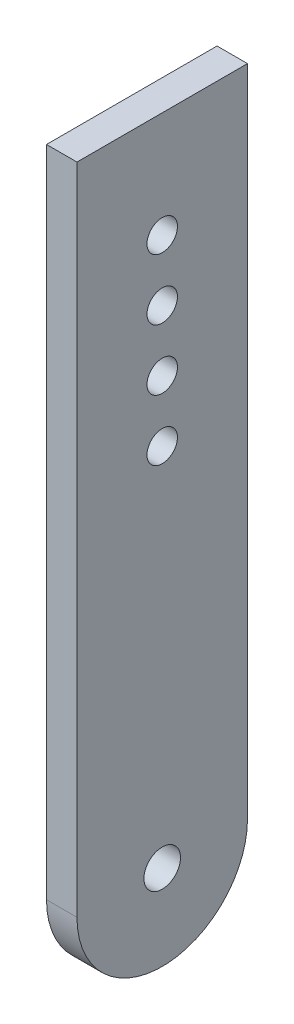
ISO-10303-21;
HEADER;
FILE_DESCRIPTION(('STEP AP214'),'2;1');
FILE_NAME('part.step','',(''),(''),'','','');
FILE_SCHEMA(('AUTOMOTIVE_DESIGN { 1 0 10303 214 1 1 1 1 }'));
ENDSEC;
DATA;
#1=APPLICATION_CONTEXT('core data for automotive mechanical design processes');
#2=APPLICATION_PROTOCOL_DEFINITION('international standard','automotive_design',2000,#1);
#3=PRODUCT_CONTEXT('',#1,'mechanical');
#4=PRODUCT('Part','Part','',(#3));
#5=PRODUCT_RELATED_PRODUCT_CATEGORY('part','',(#4));
#6=PRODUCT_DEFINITION_FORMATION('','',#4);
#7=PRODUCT_DEFINITION_CONTEXT('part definition',#1,'design');
#8=PRODUCT_DEFINITION('design','',#6,#7);
#9=PRODUCT_DEFINITION_SHAPE('','',#8);
#10=(LENGTH_UNIT() NAMED_UNIT(*) SI_UNIT(.MILLI.,.METRE.));
#11=(NAMED_UNIT(*) PLANE_ANGLE_UNIT() SI_UNIT($,.RADIAN.));
#12=(NAMED_UNIT(*) SI_UNIT($,.STERADIAN.) SOLID_ANGLE_UNIT());
#13=UNCERTAINTY_MEASURE_WITH_UNIT(LENGTH_MEASURE(1.E-05),#10,'distance_accuracy_value','');
#14=(GEOMETRIC_REPRESENTATION_CONTEXT(3) GLOBAL_UNCERTAINTY_ASSIGNED_CONTEXT((#13)) GLOBAL_UNIT_ASSIGNED_CONTEXT((#10,
#11,#12)) REPRESENTATION_CONTEXT('',''));
#15=CARTESIAN_POINT('',(0.,0.,0.));
#16=DIRECTION('',(0.,0.,1.));
#17=DIRECTION('',(1.,0.,0.));
#18=AXIS2_PLACEMENT_3D('',#15,#16,#17);
#19=CARTESIAN_POINT('',(2.5,0.,0.));
#20=DIRECTION('',(1.,0.,0.));
#21=DIRECTION('',(0.,0.,-1.));
#22=AXIS2_PLACEMENT_3D('',#19,#20,#21);
#23=PLANE('',#22);
#24=CARTESIAN_POINT('',(2.5,35.,0.));
#25=DIRECTION('',(1.,0.,0.));
#26=DIRECTION('',(0.,0.,-1.));
#27=AXIS2_PLACEMENT_3D('',#24,#25,#26);
#28=CIRCLE('',#27,1.25);
#29=CARTESIAN_POINT('',(2.5,35.,-1.24999999999995));
#30=VERTEX_POINT('',#29);
#31=EDGE_CURVE('E128',#30,#30,#28,.T.);
#32=ORIENTED_EDGE('',*,*,#31,.F.);
#33=EDGE_LOOP('',(#32));
#34=FACE_BOUND('',#33,.T.);
#35=CARTESIAN_POINT('',(2.5,45.,1.5619817514858E-13));
#36=DIRECTION('',(1.,0.,0.));
#37=DIRECTION('',(0.,0.,-1.));
#38=AXIS2_PLACEMENT_3D('',#35,#36,#37);
#39=CIRCLE('',#38,1.25);
#40=CARTESIAN_POINT('',(2.5,45.,-1.24999999999985));
#41=VERTEX_POINT('',#40);
#42=EDGE_CURVE('E116',#41,#41,#39,.T.);
#43=ORIENTED_EDGE('',*,*,#42,.F.);
#44=EDGE_LOOP('',(#43));
#45=FACE_BOUND('',#44,.T.);
#46=DIRECTION('',(0.,0.,1.));
#47=VECTOR('',#46,1.);
#48=CARTESIAN_POINT('',(2.5,53.6953395987777,7.));
#49=LINE('',#48,#47);
#50=CARTESIAN_POINT('',(2.5,53.6953395987778,-7.));
#51=VERTEX_POINT('',#50);
#52=CARTESIAN_POINT('',(2.5,53.6953395987777,7.));
#53=VERTEX_POINT('',#52);
#54=EDGE_CURVE('E86',#51,#53,#49,.T.);
#55=ORIENTED_EDGE('',*,*,#54,.T.);
#56=DIRECTION('',(0.,-1.,0.));
#57=VECTOR('',#56,1.);
#58=CARTESIAN_POINT('',(2.5,0.,7.));
#59=LINE('',#58,#57);
#60=CARTESIAN_POINT('',(2.5,0.,7.));
#61=VERTEX_POINT('',#60);
#62=EDGE_CURVE('E81',#53,#61,#59,.T.);
#63=ORIENTED_EDGE('',*,*,#62,.T.);
#64=CARTESIAN_POINT('',(2.5,0.,0.));
#65=DIRECTION('',(1.,0.,0.));
#66=DIRECTION('',(0.,0.,-1.));
#67=AXIS2_PLACEMENT_3D('',#64,#65,#66);
#68=CIRCLE('',#67,7.);
#69=CARTESIAN_POINT('',(2.5,0.,-7.));
#70=VERTEX_POINT('',#69);
#71=EDGE_CURVE('E84',#61,#70,#68,.T.);
#72=ORIENTED_EDGE('',*,*,#71,.T.);
#73=DIRECTION('',(0.,1.,0.));
#74=VECTOR('',#73,1.);
#75=CARTESIAN_POINT('',(2.5,0.,-7.));
#76=LINE('',#75,#74);
#77=EDGE_CURVE('E51',#70,#51,#76,.T.);
#78=ORIENTED_EDGE('',*,*,#77,.T.);
#79=EDGE_LOOP('',(#55,#63,#72,#78));
#80=FACE_BOUND('',#79,.T.);
#81=CARTESIAN_POINT('',(2.5,0.,0.));
#82=DIRECTION('',(1.,0.,0.));
#83=DIRECTION('',(0.,0.,-1.));
#84=AXIS2_PLACEMENT_3D('',#81,#82,#83);
#85=CIRCLE('',#84,1.5);
#86=CARTESIAN_POINT('',(2.5,0.,-1.5));
#87=VERTEX_POINT('',#86);
#88=EDGE_CURVE('E101',#87,#87,#85,.T.);
#89=ORIENTED_EDGE('',*,*,#88,.F.);
#90=EDGE_LOOP('',(#89));
#91=FACE_BOUND('',#90,.T.);
#92=CARTESIAN_POINT('',(2.5,40.,1.0413211676572E-13));
#93=DIRECTION('',(1.,0.,0.));
#94=DIRECTION('',(0.,0.,-1.));
#95=AXIS2_PLACEMENT_3D('',#92,#93,#94);
#96=CIRCLE('',#95,1.25);
#97=CARTESIAN_POINT('',(2.5,40.,-1.2499999999999));
#98=VERTEX_POINT('',#97);
#99=EDGE_CURVE('E122',#98,#98,#96,.T.);
#100=ORIENTED_EDGE('',*,*,#99,.F.);
#101=EDGE_LOOP('',(#100));
#102=FACE_BOUND('',#101,.T.);
#103=CARTESIAN_POINT('',(2.5,30.,0.));
#104=DIRECTION('',(1.,0.,0.));
#105=DIRECTION('',(0.,0.,-1.));
#106=AXIS2_PLACEMENT_3D('',#103,#104,#105);
#107=CIRCLE('',#106,1.25);
#108=CARTESIAN_POINT('',(2.5,30.,-1.25));
#109=VERTEX_POINT('',#108);
#110=EDGE_CURVE('E134',#109,#109,#107,.T.);
#111=ORIENTED_EDGE('',*,*,#110,.F.);
#112=EDGE_LOOP('',(#111));
#113=FACE_BOUND('',#112,.T.);
#114=ADVANCED_FACE('F34',(#34,#45,#80,#91,#102,#113),#23,.T.);
#115=CARTESIAN_POINT('',(0.,0.,0.));
#116=DIRECTION('',(1.,0.,0.));
#117=DIRECTION('',(0.,0.,-1.));
#118=AXIS2_PLACEMENT_3D('',#115,#116,#117);
#119=PLANE('',#118);
#120=DIRECTION('',(0.,0.,1.));
#121=VECTOR('',#120,1.);
#122=CARTESIAN_POINT('',(0.,53.6953395987777,7.));
#123=LINE('',#122,#121);
#124=CARTESIAN_POINT('',(0.,53.6953395987778,-7.));
#125=VERTEX_POINT('',#124);
#126=CARTESIAN_POINT('',(0.,53.6953395987777,7.));
#127=VERTEX_POINT('',#126);
#128=EDGE_CURVE('E98',#125,#127,#123,.T.);
#129=ORIENTED_EDGE('',*,*,#128,.F.);
#130=DIRECTION('',(0.,1.,0.));
#131=VECTOR('',#130,1.);
#132=CARTESIAN_POINT('',(0.,0.,-7.));
#133=LINE('',#132,#131);
#134=CARTESIAN_POINT('',(0.,0.,-7.));
#135=VERTEX_POINT('',#134);
#136=EDGE_CURVE('E74',#135,#125,#133,.T.);
#137=ORIENTED_EDGE('',*,*,#136,.F.);
#138=CARTESIAN_POINT('',(0.,0.,0.));
#139=DIRECTION('',(1.,0.,0.));
#140=DIRECTION('',(0.,0.,-1.));
#141=AXIS2_PLACEMENT_3D('',#138,#139,#140);
#142=CIRCLE('',#141,7.);
#143=CARTESIAN_POINT('',(0.,0.,7.));
#144=VERTEX_POINT('',#143);
#145=EDGE_CURVE('E68',#144,#135,#142,.T.);
#146=ORIENTED_EDGE('',*,*,#145,.F.);
#147=DIRECTION('',(0.,-1.,0.));
#148=VECTOR('',#147,1.);
#149=CARTESIAN_POINT('',(0.,0.,7.));
#150=LINE('',#149,#148);
#151=EDGE_CURVE('E90',#127,#144,#150,.T.);
#152=ORIENTED_EDGE('',*,*,#151,.F.);
#153=EDGE_LOOP('',(#129,#137,#146,#152));
#154=FACE_BOUND('',#153,.T.);
#155=CARTESIAN_POINT('',(0.,0.,0.));
#156=DIRECTION('',(1.,0.,0.));
#157=DIRECTION('',(0.,0.,-1.));
#158=AXIS2_PLACEMENT_3D('',#155,#156,#157);
#159=CIRCLE('',#158,1.5);
#160=CARTESIAN_POINT('',(0.,0.,-1.5));
#161=VERTEX_POINT('',#160);
#162=EDGE_CURVE('E113',#161,#161,#159,.T.);
#163=ORIENTED_EDGE('',*,*,#162,.T.);
#164=EDGE_LOOP('',(#163));
#165=FACE_BOUND('',#164,.T.);
#166=CARTESIAN_POINT('',(0.,45.,1.5619817514858E-13));
#167=DIRECTION('',(1.,0.,0.));
#168=DIRECTION('',(0.,0.,-1.));
#169=AXIS2_PLACEMENT_3D('',#166,#167,#168);
#170=CIRCLE('',#169,1.25);
#171=CARTESIAN_POINT('',(0.,45.,-1.24999999999985));
#172=VERTEX_POINT('',#171);
#173=EDGE_CURVE('E119',#172,#172,#170,.T.);
#174=ORIENTED_EDGE('',*,*,#173,.T.);
#175=EDGE_LOOP('',(#174));
#176=FACE_BOUND('',#175,.T.);
#177=CARTESIAN_POINT('',(0.,40.,1.0413211676572E-13));
#178=DIRECTION('',(1.,0.,0.));
#179=DIRECTION('',(0.,0.,-1.));
#180=AXIS2_PLACEMENT_3D('',#177,#178,#179);
#181=CIRCLE('',#180,1.25);
#182=CARTESIAN_POINT('',(0.,40.,-1.2499999999999));
#183=VERTEX_POINT('',#182);
#184=EDGE_CURVE('E125',#183,#183,#181,.T.);
#185=ORIENTED_EDGE('',*,*,#184,.T.);
#186=EDGE_LOOP('',(#185));
#187=FACE_BOUND('',#186,.T.);
#188=CARTESIAN_POINT('',(0.,35.,0.));
#189=DIRECTION('',(1.,0.,0.));
#190=DIRECTION('',(0.,0.,-1.));
#191=AXIS2_PLACEMENT_3D('',#188,#189,#190);
#192=CIRCLE('',#191,1.25);
#193=CARTESIAN_POINT('',(0.,35.,-1.24999999999995));
#194=VERTEX_POINT('',#193);
#195=EDGE_CURVE('E131',#194,#194,#192,.T.);
#196=ORIENTED_EDGE('',*,*,#195,.T.);
#197=EDGE_LOOP('',(#196));
#198=FACE_BOUND('',#197,.T.);
#199=CARTESIAN_POINT('',(0.,30.,0.));
#200=DIRECTION('',(1.,0.,0.));
#201=DIRECTION('',(0.,0.,-1.));
#202=AXIS2_PLACEMENT_3D('',#199,#200,#201);
#203=CIRCLE('',#202,1.25);
#204=CARTESIAN_POINT('',(0.,30.,-1.25));
#205=VERTEX_POINT('',#204);
#206=EDGE_CURVE('E137',#205,#205,#203,.T.);
#207=ORIENTED_EDGE('',*,*,#206,.T.);
#208=EDGE_LOOP('',(#207));
#209=FACE_BOUND('',#208,.T.);
#210=ADVANCED_FACE('F109',(#154,#165,#176,#187,#198,#209),#119,.F.);
#211=CARTESIAN_POINT('',(2.5,53.6953395987777,7.));
#212=DIRECTION('',(0.,-1.,0.));
#213=DIRECTION('',(0.,0.,-1.));
#214=AXIS2_PLACEMENT_3D('',#211,#212,#213);
#215=PLANE('',#214);
#216=ORIENTED_EDGE('',*,*,#128,.T.);
#217=DIRECTION('',(-1.,0.,0.));
#218=VECTOR('',#217,1.);
#219=CARTESIAN_POINT('',(2.5,53.6953395987777,7.));
#220=LINE('',#219,#218);
#221=EDGE_CURVE('E11',#53,#127,#220,.T.);
#222=ORIENTED_EDGE('',*,*,#221,.F.);
#223=ORIENTED_EDGE('',*,*,#54,.F.);
#224=DIRECTION('',(-1.,0.,0.));
#225=VECTOR('',#224,1.);
#226=CARTESIAN_POINT('',(2.5,53.6953395987778,-7.));
#227=LINE('',#226,#225);
#228=EDGE_CURVE('E94',#51,#125,#227,.T.);
#229=ORIENTED_EDGE('',*,*,#228,.T.);
#230=EDGE_LOOP('',(#216,#222,#223,#229));
#231=FACE_BOUND('',#230,.T.);
#232=ADVANCED_FACE('F36',(#231),#215,.F.);
#233=CARTESIAN_POINT('',(2.5,0.,7.));
#234=DIRECTION('',(0.,0.,-1.));
#235=DIRECTION('',(-1.,0.,0.));
#236=AXIS2_PLACEMENT_3D('',#233,#234,#235);
#237=PLANE('',#236);
#238=ORIENTED_EDGE('',*,*,#151,.T.);
#239=DIRECTION('',(-1.,0.,0.));
#240=VECTOR('',#239,1.);
#241=CARTESIAN_POINT('',(2.5,0.,7.));
#242=LINE('',#241,#240);
#243=EDGE_CURVE('E43',#61,#144,#242,.T.);
#244=ORIENTED_EDGE('',*,*,#243,.F.);
#245=ORIENTED_EDGE('',*,*,#62,.F.);
#246=ORIENTED_EDGE('',*,*,#221,.T.);
#247=EDGE_LOOP('',(#238,#244,#245,#246));
#248=FACE_BOUND('',#247,.T.);
#249=ADVANCED_FACE('F89',(#248),#237,.F.);
#250=CARTESIAN_POINT('',(2.5,0.,0.));
#251=DIRECTION('',(-1.,0.,0.));
#252=DIRECTION('',(0.,0.,1.));
#253=AXIS2_PLACEMENT_3D('',#250,#251,#252);
#254=CYLINDRICAL_SURFACE('',#253,7.);
#255=ORIENTED_EDGE('',*,*,#145,.T.);
#256=DIRECTION('',(-1.,0.,0.));
#257=VECTOR('',#256,1.);
#258=CARTESIAN_POINT('',(2.5,0.,-7.));
#259=LINE('',#258,#257);
#260=EDGE_CURVE('E91',#70,#135,#259,.T.);
#261=ORIENTED_EDGE('',*,*,#260,.F.);
#262=ORIENTED_EDGE('',*,*,#71,.F.);
#263=ORIENTED_EDGE('',*,*,#243,.T.);
#264=EDGE_LOOP('',(#255,#261,#262,#263));
#265=FACE_BOUND('',#264,.T.);
#266=ADVANCED_FACE('F92',(#265),#254,.T.);
#267=CARTESIAN_POINT('',(2.5,0.,-7.));
#268=DIRECTION('',(0.,0.,1.));
#269=DIRECTION('',(0.,-1.,0.));
#270=AXIS2_PLACEMENT_3D('',#267,#268,#269);
#271=PLANE('',#270);
#272=ORIENTED_EDGE('',*,*,#136,.T.);
#273=ORIENTED_EDGE('',*,*,#228,.F.);
#274=ORIENTED_EDGE('',*,*,#77,.F.);
#275=ORIENTED_EDGE('',*,*,#260,.T.);
#276=EDGE_LOOP('',(#272,#273,#274,#275));
#277=FACE_BOUND('',#276,.T.);
#278=ADVANCED_FACE('F106',(#277),#271,.F.);
#279=CARTESIAN_POINT('',(2.5,0.,0.));
#280=DIRECTION('',(-1.,0.,0.));
#281=DIRECTION('',(0.,0.,1.));
#282=AXIS2_PLACEMENT_3D('',#279,#280,#281);
#283=CYLINDRICAL_SURFACE('',#282,1.5);
#284=ORIENTED_EDGE('',*,*,#88,.T.);
#285=EDGE_LOOP('',(#284));
#286=FACE_BOUND('',#285,.T.);
#287=ORIENTED_EDGE('',*,*,#162,.F.);
#288=EDGE_LOOP('',(#287));
#289=FACE_BOUND('',#288,.T.);
#290=ADVANCED_FACE('F156',(#286,#289),#283,.F.);
#291=CARTESIAN_POINT('',(2.5,45.,1.5619817514858E-13));
#292=DIRECTION('',(-1.,0.,0.));
#293=DIRECTION('',(0.,0.,1.));
#294=AXIS2_PLACEMENT_3D('',#291,#292,#293);
#295=CYLINDRICAL_SURFACE('',#294,1.25);
#296=ORIENTED_EDGE('',*,*,#42,.T.);
#297=EDGE_LOOP('',(#296));
#298=FACE_BOUND('',#297,.T.);
#299=ORIENTED_EDGE('',*,*,#173,.F.);
#300=EDGE_LOOP('',(#299));
#301=FACE_BOUND('',#300,.T.);
#302=ADVANCED_FACE('F202',(#298,#301),#295,.F.);
#303=CARTESIAN_POINT('',(2.5,40.,1.0413211676572E-13));
#304=DIRECTION('',(-1.,0.,0.));
#305=DIRECTION('',(0.,0.,1.));
#306=AXIS2_PLACEMENT_3D('',#303,#304,#305);
#307=CYLINDRICAL_SURFACE('',#306,1.25);
#308=ORIENTED_EDGE('',*,*,#99,.T.);
#309=EDGE_LOOP('',(#308));
#310=FACE_BOUND('',#309,.T.);
#311=ORIENTED_EDGE('',*,*,#184,.F.);
#312=EDGE_LOOP('',(#311));
#313=FACE_BOUND('',#312,.T.);
#314=ADVANCED_FACE('F210',(#310,#313),#307,.F.);
#315=CARTESIAN_POINT('',(2.5,35.,0.));
#316=DIRECTION('',(-1.,0.,0.));
#317=DIRECTION('',(0.,0.,1.));
#318=AXIS2_PLACEMENT_3D('',#315,#316,#317);
#319=CYLINDRICAL_SURFACE('',#318,1.25);
#320=ORIENTED_EDGE('',*,*,#31,.T.);
#321=EDGE_LOOP('',(#320));
#322=FACE_BOUND('',#321,.T.);
#323=ORIENTED_EDGE('',*,*,#195,.F.);
#324=EDGE_LOOP('',(#323));
#325=FACE_BOUND('',#324,.T.);
#326=ADVANCED_FACE('F218',(#322,#325),#319,.F.);
#327=CARTESIAN_POINT('',(2.5,30.,0.));
#328=DIRECTION('',(-1.,0.,0.));
#329=DIRECTION('',(0.,0.,1.));
#330=AXIS2_PLACEMENT_3D('',#327,#328,#329);
#331=CYLINDRICAL_SURFACE('',#330,1.25);
#332=ORIENTED_EDGE('',*,*,#110,.T.);
#333=EDGE_LOOP('',(#332));
#334=FACE_BOUND('',#333,.T.);
#335=ORIENTED_EDGE('',*,*,#206,.F.);
#336=EDGE_LOOP('',(#335));
#337=FACE_BOUND('',#336,.T.);
#338=ADVANCED_FACE('F143',(#334,#337),#331,.F.);
#339=CLOSED_SHELL('',(#114,#210,#232,#249,#266,#278,#290,#302,#314,#326,#338));
#340=MANIFOLD_SOLID_BREP('B2',#339);
#341=ADVANCED_BREP_SHAPE_REPRESENTATION('',(#18,#340),#14);
#342=SHAPE_DEFINITION_REPRESENTATION(#9,#341);
ENDSEC;
END-ISO-10303-21;
